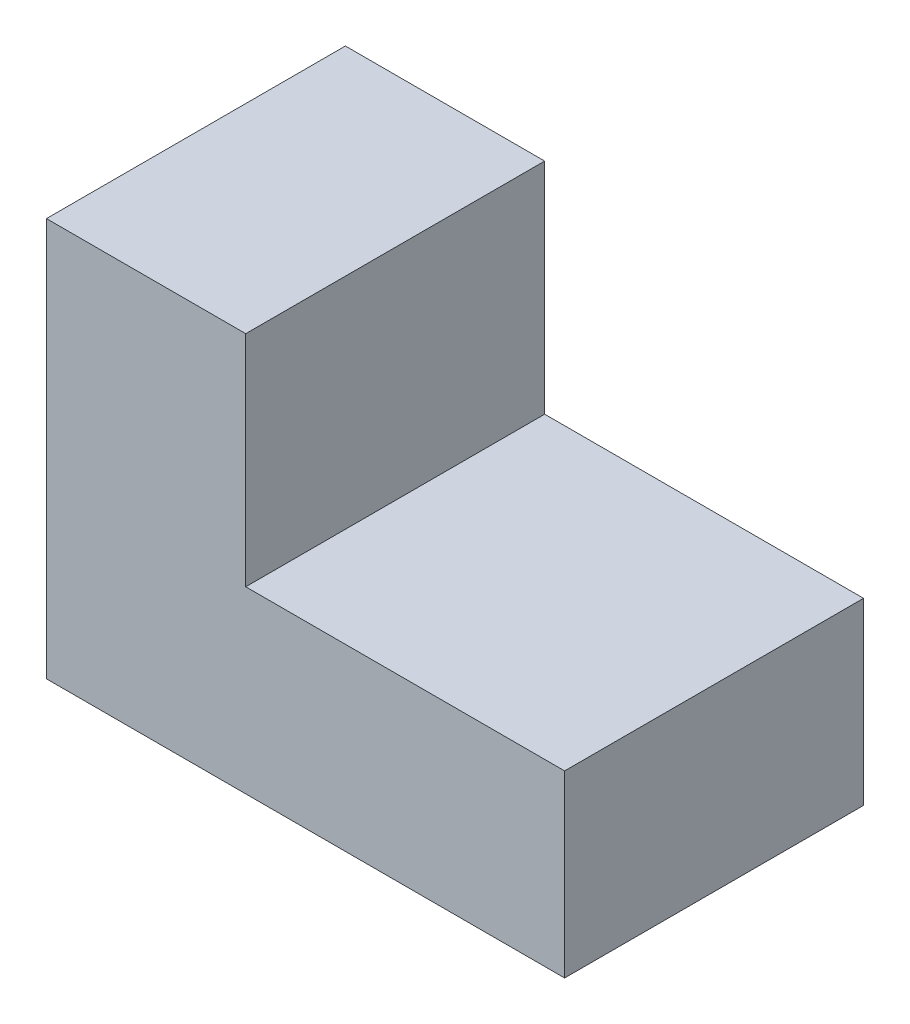
ISO-10303-21;
HEADER;
FILE_DESCRIPTION(('STEP AP214'),'2;1');
FILE_NAME('part.step','',(''),(''),'','','');
FILE_SCHEMA(('AUTOMOTIVE_DESIGN { 1 0 10303 214 1 1 1 1 }'));
ENDSEC;
DATA;
#1=APPLICATION_CONTEXT('core data for automotive mechanical design processes');
#2=APPLICATION_PROTOCOL_DEFINITION('international standard','automotive_design',2000,#1);
#3=PRODUCT_CONTEXT('',#1,'mechanical');
#4=PRODUCT('Part','Part','',(#3));
#5=PRODUCT_RELATED_PRODUCT_CATEGORY('part','',(#4));
#6=PRODUCT_DEFINITION_FORMATION('','',#4);
#7=PRODUCT_DEFINITION_CONTEXT('part definition',#1,'design');
#8=PRODUCT_DEFINITION('design','',#6,#7);
#9=PRODUCT_DEFINITION_SHAPE('','',#8);
#10=(LENGTH_UNIT() NAMED_UNIT(*) SI_UNIT(.MILLI.,.METRE.));
#11=(NAMED_UNIT(*) PLANE_ANGLE_UNIT() SI_UNIT($,.RADIAN.));
#12=(NAMED_UNIT(*) SI_UNIT($,.STERADIAN.) SOLID_ANGLE_UNIT());
#13=UNCERTAINTY_MEASURE_WITH_UNIT(LENGTH_MEASURE(1.E-05),#10,'distance_accuracy_value','');
#14=(GEOMETRIC_REPRESENTATION_CONTEXT(3) GLOBAL_UNCERTAINTY_ASSIGNED_CONTEXT((#13)) GLOBAL_UNIT_ASSIGNED_CONTEXT((#10,
#11,#12)) REPRESENTATION_CONTEXT('',''));
#15=CARTESIAN_POINT('',(0.,0.,0.));
#16=DIRECTION('',(0.,0.,1.));
#17=DIRECTION('',(1.,0.,0.));
#18=AXIS2_PLACEMENT_3D('',#15,#16,#17);
#19=CARTESIAN_POINT('',(7.,-12.,-4.));
#20=DIRECTION('',(0.,0.,-1.));
#21=DIRECTION('',(1.,0.,0.));
#22=AXIS2_PLACEMENT_3D('',#19,#20,#21);
#23=PLANE('',#22);
#24=DIRECTION('',(0.,-1.,0.));
#25=VECTOR('',#24,1.);
#26=CARTESIAN_POINT('',(7.,8.,-4.));
#27=LINE('',#26,#25);
#28=CARTESIAN_POINT('',(7.,8.,-4.));
#29=VERTEX_POINT('',#28);
#30=CARTESIAN_POINT('',(7.,-12.,-4.));
#31=VERTEX_POINT('',#30);
#32=EDGE_CURVE('E63',#29,#31,#27,.T.);
#33=ORIENTED_EDGE('',*,*,#32,.F.);
#34=DIRECTION('',(-1.,0.,0.));
#35=VECTOR('',#34,1.);
#36=CARTESIAN_POINT('',(17.,8.,-4.));
#37=LINE('',#36,#35);
#38=CARTESIAN_POINT('',(17.,8.,-4.));
#39=VERTEX_POINT('',#38);
#40=EDGE_CURVE('E62',#39,#29,#37,.T.);
#41=ORIENTED_EDGE('',*,*,#40,.F.);
#42=DIRECTION('',(0.,1.,0.));
#43=VECTOR('',#42,1.);
#44=CARTESIAN_POINT('',(17.,-3.,-4.));
#45=LINE('',#44,#43);
#46=CARTESIAN_POINT('',(17.,-3.,-4.));
#47=VERTEX_POINT('',#46);
#48=EDGE_CURVE('E61',#47,#39,#45,.T.);
#49=ORIENTED_EDGE('',*,*,#48,.F.);
#50=DIRECTION('',(-1.,0.,0.));
#51=VECTOR('',#50,1.);
#52=CARTESIAN_POINT('',(33.,-3.,-4.));
#53=LINE('',#52,#51);
#54=CARTESIAN_POINT('',(33.,-3.,-4.));
#55=VERTEX_POINT('',#54);
#56=EDGE_CURVE('E60',#55,#47,#53,.T.);
#57=ORIENTED_EDGE('',*,*,#56,.F.);
#58=DIRECTION('',(0.,1.,0.));
#59=VECTOR('',#58,1.);
#60=CARTESIAN_POINT('',(33.,-12.,-4.));
#61=LINE('',#60,#59);
#62=CARTESIAN_POINT('',(33.,-12.,-4.));
#63=VERTEX_POINT('',#62);
#64=EDGE_CURVE('E59',#63,#55,#61,.T.);
#65=ORIENTED_EDGE('',*,*,#64,.F.);
#66=DIRECTION('',(1.,0.,0.));
#67=VECTOR('',#66,1.);
#68=CARTESIAN_POINT('',(7.,-12.,-4.));
#69=LINE('',#68,#67);
#70=EDGE_CURVE('E58',#31,#63,#69,.T.);
#71=ORIENTED_EDGE('',*,*,#70,.F.);
#72=EDGE_LOOP('',(#33,#41,#49,#57,#65,#71));
#73=FACE_BOUND('',#72,.T.);
#74=ADVANCED_FACE('F6',(#73),#23,.T.);
#75=CARTESIAN_POINT('',(7.,-12.,11.));
#76=DIRECTION('',(0.,0.,1.));
#77=DIRECTION('',(1.,0.,0.));
#78=AXIS2_PLACEMENT_3D('',#75,#76,#77);
#79=PLANE('',#78);
#80=DIRECTION('',(1.,0.,0.));
#81=VECTOR('',#80,1.);
#82=CARTESIAN_POINT('',(7.,-12.,11.));
#83=LINE('',#82,#81);
#84=CARTESIAN_POINT('',(7.,-12.,11.));
#85=VERTEX_POINT('',#84);
#86=CARTESIAN_POINT('',(33.,-12.,11.));
#87=VERTEX_POINT('',#86);
#88=EDGE_CURVE('E64',#85,#87,#83,.T.);
#89=ORIENTED_EDGE('',*,*,#88,.T.);
#90=DIRECTION('',(0.,1.,0.));
#91=VECTOR('',#90,1.);
#92=CARTESIAN_POINT('',(33.,-12.,11.));
#93=LINE('',#92,#91);
#94=CARTESIAN_POINT('',(33.,-3.,11.));
#95=VERTEX_POINT('',#94);
#96=EDGE_CURVE('E65',#87,#95,#93,.T.);
#97=ORIENTED_EDGE('',*,*,#96,.T.);
#98=DIRECTION('',(-1.,0.,0.));
#99=VECTOR('',#98,1.);
#100=CARTESIAN_POINT('',(33.,-3.,11.));
#101=LINE('',#100,#99);
#102=CARTESIAN_POINT('',(17.,-3.,11.));
#103=VERTEX_POINT('',#102);
#104=EDGE_CURVE('E66',#95,#103,#101,.T.);
#105=ORIENTED_EDGE('',*,*,#104,.T.);
#106=DIRECTION('',(0.,1.,0.));
#107=VECTOR('',#106,1.);
#108=CARTESIAN_POINT('',(17.,-3.,11.));
#109=LINE('',#108,#107);
#110=CARTESIAN_POINT('',(17.,8.,11.));
#111=VERTEX_POINT('',#110);
#112=EDGE_CURVE('E67',#103,#111,#109,.T.);
#113=ORIENTED_EDGE('',*,*,#112,.T.);
#114=DIRECTION('',(-1.,0.,0.));
#115=VECTOR('',#114,1.);
#116=CARTESIAN_POINT('',(17.,8.,11.));
#117=LINE('',#116,#115);
#118=CARTESIAN_POINT('',(7.,8.,11.));
#119=VERTEX_POINT('',#118);
#120=EDGE_CURVE('E68',#111,#119,#117,.T.);
#121=ORIENTED_EDGE('',*,*,#120,.T.);
#122=DIRECTION('',(0.,-1.,0.));
#123=VECTOR('',#122,1.);
#124=CARTESIAN_POINT('',(7.,8.,11.));
#125=LINE('',#124,#123);
#126=EDGE_CURVE('E69',#119,#85,#125,.T.);
#127=ORIENTED_EDGE('',*,*,#126,.T.);
#128=EDGE_LOOP('',(#89,#97,#105,#113,#121,#127));
#129=FACE_BOUND('',#128,.T.);
#130=ADVANCED_FACE('F14',(#129),#79,.T.);
#131=CARTESIAN_POINT('',(7.,-12.,-4.));
#132=DIRECTION('',(0.,-1.,0.));
#133=DIRECTION('',(1.,0.,0.));
#134=AXIS2_PLACEMENT_3D('',#131,#132,#133);
#135=PLANE('',#134);
#136=ORIENTED_EDGE('',*,*,#70,.T.);
#137=DIRECTION('',(0.,0.,1.));
#138=VECTOR('',#137,1.);
#139=CARTESIAN_POINT('',(33.,-12.,-4.));
#140=LINE('',#139,#138);
#141=EDGE_CURVE('E71',#63,#87,#140,.T.);
#142=ORIENTED_EDGE('',*,*,#141,.T.);
#143=ORIENTED_EDGE('',*,*,#88,.F.);
#144=DIRECTION('',(0.,0.,1.));
#145=VECTOR('',#144,1.);
#146=CARTESIAN_POINT('',(7.,-12.,-4.));
#147=LINE('',#146,#145);
#148=EDGE_CURVE('E70',#31,#85,#147,.T.);
#149=ORIENTED_EDGE('',*,*,#148,.F.);
#150=EDGE_LOOP('',(#136,#142,#143,#149));
#151=FACE_BOUND('',#150,.T.);
#152=ADVANCED_FACE('F22',(#151),#135,.T.);
#153=CARTESIAN_POINT('',(33.,-12.,-4.));
#154=DIRECTION('',(1.,0.,0.));
#155=DIRECTION('',(0.,1.,0.));
#156=AXIS2_PLACEMENT_3D('',#153,#154,#155);
#157=PLANE('',#156);
#158=ORIENTED_EDGE('',*,*,#64,.T.);
#159=DIRECTION('',(0.,0.,1.));
#160=VECTOR('',#159,1.);
#161=CARTESIAN_POINT('',(33.,-3.,-4.));
#162=LINE('',#161,#160);
#163=EDGE_CURVE('E72',#55,#95,#162,.T.);
#164=ORIENTED_EDGE('',*,*,#163,.T.);
#165=ORIENTED_EDGE('',*,*,#96,.F.);
#166=ORIENTED_EDGE('',*,*,#141,.F.);
#167=EDGE_LOOP('',(#158,#164,#165,#166));
#168=FACE_BOUND('',#167,.T.);
#169=ADVANCED_FACE('F28',(#168),#157,.T.);
#170=CARTESIAN_POINT('',(33.,-3.,-4.));
#171=DIRECTION('',(0.,1.,0.));
#172=DIRECTION('',(-1.,0.,0.));
#173=AXIS2_PLACEMENT_3D('',#170,#171,#172);
#174=PLANE('',#173);
#175=ORIENTED_EDGE('',*,*,#56,.T.);
#176=DIRECTION('',(0.,0.,1.));
#177=VECTOR('',#176,1.);
#178=CARTESIAN_POINT('',(17.,-3.,-4.));
#179=LINE('',#178,#177);
#180=EDGE_CURVE('E73',#47,#103,#179,.T.);
#181=ORIENTED_EDGE('',*,*,#180,.T.);
#182=ORIENTED_EDGE('',*,*,#104,.F.);
#183=ORIENTED_EDGE('',*,*,#163,.F.);
#184=EDGE_LOOP('',(#175,#181,#182,#183));
#185=FACE_BOUND('',#184,.T.);
#186=ADVANCED_FACE('F34',(#185),#174,.T.);
#187=CARTESIAN_POINT('',(17.,-3.,-4.));
#188=DIRECTION('',(1.,0.,0.));
#189=DIRECTION('',(0.,1.,0.));
#190=AXIS2_PLACEMENT_3D('',#187,#188,#189);
#191=PLANE('',#190);
#192=ORIENTED_EDGE('',*,*,#48,.T.);
#193=DIRECTION('',(0.,0.,1.));
#194=VECTOR('',#193,1.);
#195=CARTESIAN_POINT('',(17.,8.,-4.));
#196=LINE('',#195,#194);
#197=EDGE_CURVE('E74',#39,#111,#196,.T.);
#198=ORIENTED_EDGE('',*,*,#197,.T.);
#199=ORIENTED_EDGE('',*,*,#112,.F.);
#200=ORIENTED_EDGE('',*,*,#180,.F.);
#201=EDGE_LOOP('',(#192,#198,#199,#200));
#202=FACE_BOUND('',#201,.T.);
#203=ADVANCED_FACE('F40',(#202),#191,.T.);
#204=CARTESIAN_POINT('',(17.,8.,-4.));
#205=DIRECTION('',(0.,1.,0.));
#206=DIRECTION('',(-1.,0.,0.));
#207=AXIS2_PLACEMENT_3D('',#204,#205,#206);
#208=PLANE('',#207);
#209=ORIENTED_EDGE('',*,*,#40,.T.);
#210=DIRECTION('',(0.,0.,1.));
#211=VECTOR('',#210,1.);
#212=CARTESIAN_POINT('',(7.,8.,-4.));
#213=LINE('',#212,#211);
#214=EDGE_CURVE('E75',#29,#119,#213,.T.);
#215=ORIENTED_EDGE('',*,*,#214,.T.);
#216=ORIENTED_EDGE('',*,*,#120,.F.);
#217=ORIENTED_EDGE('',*,*,#197,.F.);
#218=EDGE_LOOP('',(#209,#215,#216,#217));
#219=FACE_BOUND('',#218,.T.);
#220=ADVANCED_FACE('F46',(#219),#208,.T.);
#221=CARTESIAN_POINT('',(7.,8.,-4.));
#222=DIRECTION('',(-1.,0.,0.));
#223=DIRECTION('',(0.,-1.,0.));
#224=AXIS2_PLACEMENT_3D('',#221,#222,#223);
#225=PLANE('',#224);
#226=ORIENTED_EDGE('',*,*,#32,.T.);
#227=ORIENTED_EDGE('',*,*,#148,.T.);
#228=ORIENTED_EDGE('',*,*,#126,.F.);
#229=ORIENTED_EDGE('',*,*,#214,.F.);
#230=EDGE_LOOP('',(#226,#227,#228,#229));
#231=FACE_BOUND('',#230,.T.);
#232=ADVANCED_FACE('F52',(#231),#225,.T.);
#233=CLOSED_SHELL('',(#74,#130,#152,#169,#186,#203,#220,#232));
#234=MANIFOLD_SOLID_BREP('B1',#233);
#235=ADVANCED_BREP_SHAPE_REPRESENTATION('',(#18,#234),#14);
#236=SHAPE_DEFINITION_REPRESENTATION(#9,#235);
ENDSEC;
END-ISO-10303-21;
